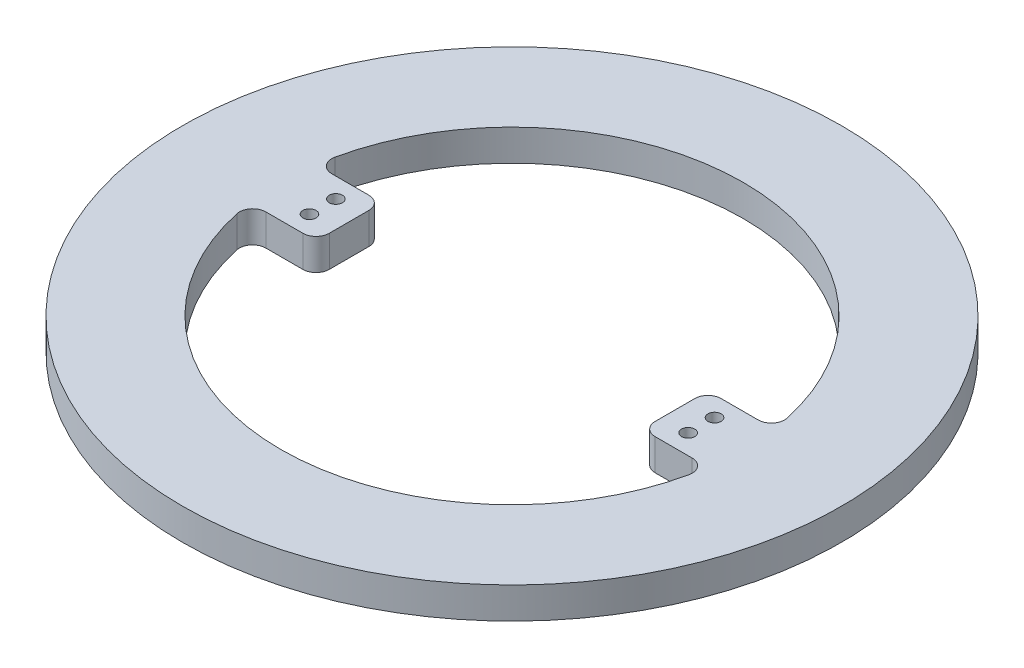
ISO-10303-21;
HEADER;
FILE_DESCRIPTION(('STEP AP214'),'2;1');
FILE_NAME('part.step','',(''),(''),'','','');
FILE_SCHEMA(('AUTOMOTIVE_DESIGN { 1 0 10303 214 1 1 1 1 }'));
ENDSEC;
DATA;
#1=APPLICATION_CONTEXT('core data for automotive mechanical design processes');
#2=APPLICATION_PROTOCOL_DEFINITION('international standard','automotive_design',2000,#1);
#3=PRODUCT_CONTEXT('',#1,'mechanical');
#4=PRODUCT('Part','Part','',(#3));
#5=PRODUCT_RELATED_PRODUCT_CATEGORY('part','',(#4));
#6=PRODUCT_DEFINITION_FORMATION('','',#4);
#7=PRODUCT_DEFINITION_CONTEXT('part definition',#1,'design');
#8=PRODUCT_DEFINITION('design','',#6,#7);
#9=PRODUCT_DEFINITION_SHAPE('','',#8);
#10=(LENGTH_UNIT() NAMED_UNIT(*) SI_UNIT(.MILLI.,.METRE.));
#11=(NAMED_UNIT(*) PLANE_ANGLE_UNIT() SI_UNIT($,.RADIAN.));
#12=(NAMED_UNIT(*) SI_UNIT($,.STERADIAN.) SOLID_ANGLE_UNIT());
#13=UNCERTAINTY_MEASURE_WITH_UNIT(LENGTH_MEASURE(1.E-05),#10,'distance_accuracy_value','');
#14=(GEOMETRIC_REPRESENTATION_CONTEXT(3) GLOBAL_UNCERTAINTY_ASSIGNED_CONTEXT((#13)) GLOBAL_UNIT_ASSIGNED_CONTEXT((#10,
#11,#12)) REPRESENTATION_CONTEXT('',''));
#15=CARTESIAN_POINT('',(0.,0.,0.));
#16=DIRECTION('',(0.,0.,1.));
#17=DIRECTION('',(1.,0.,0.));
#18=AXIS2_PLACEMENT_3D('',#15,#16,#17);
#19=CARTESIAN_POINT('',(0.,4.75,0.));
#20=DIRECTION('',(0.,1.,0.));
#21=DIRECTION('',(0.,0.,1.));
#22=AXIS2_PLACEMENT_3D('',#19,#20,#21);
#23=PLANE('',#22);
#24=CARTESIAN_POINT('',(28.6980858791868,4.75,2.));
#25=DIRECTION('',(0.,1.,0.));
#26=DIRECTION('',(0.,0.,-1.));
#27=AXIS2_PLACEMENT_3D('',#24,#25,#26);
#28=CIRCLE('',#27,1.);
#29=CARTESIAN_POINT('',(28.6980858791868,4.75,0.999999999999997));
#30=VERTEX_POINT('',#29);
#31=EDGE_CURVE('E527',#30,#30,#28,.T.);
#32=ORIENTED_EDGE('',*,*,#31,.F.);
#33=EDGE_LOOP('',(#32));
#34=FACE_BOUND('',#33,.T.);
#35=CARTESIAN_POINT('',(-28.6980858791868,4.75,2.));
#36=DIRECTION('',(0.,1.,0.));
#37=DIRECTION('',(0.,0.,1.));
#38=AXIS2_PLACEMENT_3D('',#35,#36,#37);
#39=CIRCLE('',#38,1.);
#40=CARTESIAN_POINT('',(-28.6980858791868,4.75,3.));
#41=VERTEX_POINT('',#40);
#42=EDGE_CURVE('E207',#41,#41,#39,.T.);
#43=ORIENTED_EDGE('',*,*,#42,.F.);
#44=EDGE_LOOP('',(#43));
#45=FACE_BOUND('',#44,.T.);
#46=CARTESIAN_POINT('',(0.,4.75,0.));
#47=DIRECTION('',(0.,1.,0.));
#48=DIRECTION('',(0.,0.,1.));
#49=AXIS2_PLACEMENT_3D('',#46,#47,#48);
#50=CIRCLE('',#49,49.95);
#51=CARTESIAN_POINT('',(0.,4.75,49.95));
#52=VERTEX_POINT('',#51);
#53=EDGE_CURVE('E11',#52,#52,#50,.T.);
#54=ORIENTED_EDGE('',*,*,#53,.T.);
#55=EDGE_LOOP('',(#54));
#56=FACE_BOUND('',#55,.T.);
#57=DIRECTION('',(-1.,0.,0.));
#58=VECTOR('',#57,1.);
#59=CARTESIAN_POINT('',(26.6980858791869,4.75,5.));
#60=LINE('',#59,#58);
#61=CARTESIAN_POINT('',(32.3068293455141,4.75,5.));
#62=VERTEX_POINT('',#61);
#63=CARTESIAN_POINT('',(26.6980858791869,4.75,5.));
#64=VERTEX_POINT('',#63);
#65=EDGE_CURVE('E162',#62,#64,#60,.T.);
#66=ORIENTED_EDGE('',*,*,#65,.F.);
#67=CARTESIAN_POINT('',(32.3068293455141,4.75,7.));
#68=DIRECTION('',(0.,1.,0.));
#69=DIRECTION('',(0.,0.,-1.));
#70=AXIS2_PLACEMENT_3D('',#67,#68,#69);
#71=CIRCLE('',#70,2.);
#72=CARTESIAN_POINT('',(34.2614732844072,4.75,7.42351749922346));
#73=VERTEX_POINT('',#72);
#74=EDGE_CURVE('E154',#73,#62,#71,.T.);
#75=ORIENTED_EDGE('',*,*,#74,.F.);
#76=CARTESIAN_POINT('',(0.,4.75,0.));
#77=DIRECTION('',(0.,1.,0.));
#78=DIRECTION('',(0.,0.,1.));
#79=AXIS2_PLACEMENT_3D('',#76,#77,#78);
#80=CIRCLE('',#79,35.0564853298135);
#81=CARTESIAN_POINT('',(-34.2614732844072,4.75,7.42351749922347));
#82=VERTEX_POINT('',#81);
#83=EDGE_CURVE('E204',#82,#73,#80,.T.);
#84=ORIENTED_EDGE('',*,*,#83,.F.);
#85=CARTESIAN_POINT('',(-32.3068293455141,4.75,7.));
#86=DIRECTION('',(0.,1.,0.));
#87=DIRECTION('',(0.,0.,1.));
#88=AXIS2_PLACEMENT_3D('',#85,#86,#87);
#89=CIRCLE('',#88,2.);
#90=CARTESIAN_POINT('',(-32.3068293455141,4.75,5.));
#91=VERTEX_POINT('',#90);
#92=EDGE_CURVE('E202',#91,#82,#89,.T.);
#93=ORIENTED_EDGE('',*,*,#92,.F.);
#94=DIRECTION('',(-1.,0.,0.));
#95=VECTOR('',#94,1.);
#96=CARTESIAN_POINT('',(-32.3068293455141,4.75,5.));
#97=LINE('',#96,#95);
#98=CARTESIAN_POINT('',(-26.6980858791869,4.75,5.));
#99=VERTEX_POINT('',#98);
#100=EDGE_CURVE('E200',#99,#91,#97,.T.);
#101=ORIENTED_EDGE('',*,*,#100,.F.);
#102=CARTESIAN_POINT('',(-26.6980858791868,4.75,3.));
#103=DIRECTION('',(0.,-1.,0.));
#104=DIRECTION('',(0.,0.,-1.));
#105=AXIS2_PLACEMENT_3D('',#102,#103,#104);
#106=CIRCLE('',#105,2.);
#107=CARTESIAN_POINT('',(-24.6980858791868,4.75,2.99999999999999));
#108=VERTEX_POINT('',#107);
#109=EDGE_CURVE('E198',#108,#99,#106,.T.);
#110=ORIENTED_EDGE('',*,*,#109,.F.);
#111=DIRECTION('',(0.,0.,1.));
#112=VECTOR('',#111,1.);
#113=CARTESIAN_POINT('',(-24.6980858791868,4.75,-2.99999999999999));
#114=LINE('',#113,#112);
#115=CARTESIAN_POINT('',(-24.6980858791868,4.75,-2.99999999999999));
#116=VERTEX_POINT('',#115);
#117=EDGE_CURVE('E196',#116,#108,#114,.T.);
#118=ORIENTED_EDGE('',*,*,#117,.F.);
#119=CARTESIAN_POINT('',(-26.6980858791868,4.75,-3.));
#120=DIRECTION('',(0.,-1.,0.));
#121=DIRECTION('',(0.,0.,1.));
#122=AXIS2_PLACEMENT_3D('',#119,#120,#121);
#123=CIRCLE('',#122,2.);
#124=CARTESIAN_POINT('',(-26.6980858791869,4.75,-5.));
#125=VERTEX_POINT('',#124);
#126=EDGE_CURVE('E194',#125,#116,#123,.T.);
#127=ORIENTED_EDGE('',*,*,#126,.F.);
#128=DIRECTION('',(1.,0.,0.));
#129=VECTOR('',#128,1.);
#130=CARTESIAN_POINT('',(-32.3068293455141,4.75,-5.));
#131=LINE('',#130,#129);
#132=CARTESIAN_POINT('',(-32.3068293455141,4.75,-5.));
#133=VERTEX_POINT('',#132);
#134=EDGE_CURVE('E192',#133,#125,#131,.T.);
#135=ORIENTED_EDGE('',*,*,#134,.F.);
#136=CARTESIAN_POINT('',(-32.3068293455141,4.75,-7.));
#137=DIRECTION('',(0.,1.,0.));
#138=DIRECTION('',(0.,0.,-1.));
#139=AXIS2_PLACEMENT_3D('',#136,#137,#138);
#140=CIRCLE('',#139,2.);
#141=CARTESIAN_POINT('',(-34.2614732844072,4.75,-7.42351749922347));
#142=VERTEX_POINT('',#141);
#143=EDGE_CURVE('E190',#142,#133,#140,.T.);
#144=ORIENTED_EDGE('',*,*,#143,.F.);
#145=CARTESIAN_POINT('',(0.,4.75,0.));
#146=DIRECTION('',(0.,1.,0.));
#147=DIRECTION('',(0.,0.,1.));
#148=AXIS2_PLACEMENT_3D('',#145,#146,#147);
#149=CIRCLE('',#148,35.0564853298135);
#150=CARTESIAN_POINT('',(34.2614732844072,4.75,-7.42351749922347));
#151=VERTEX_POINT('',#150);
#152=EDGE_CURVE('E188',#151,#142,#149,.T.);
#153=ORIENTED_EDGE('',*,*,#152,.F.);
#154=CARTESIAN_POINT('',(32.3068293455141,4.75,-7.));
#155=DIRECTION('',(0.,1.,0.));
#156=DIRECTION('',(0.,0.,1.));
#157=AXIS2_PLACEMENT_3D('',#154,#155,#156);
#158=CIRCLE('',#157,2.);
#159=CARTESIAN_POINT('',(32.3068293455141,4.75,-5.));
#160=VERTEX_POINT('',#159);
#161=EDGE_CURVE('E186',#160,#151,#158,.T.);
#162=ORIENTED_EDGE('',*,*,#161,.F.);
#163=DIRECTION('',(1.,0.,0.));
#164=VECTOR('',#163,1.);
#165=CARTESIAN_POINT('',(26.6980858791869,4.75,-5.));
#166=LINE('',#165,#164);
#167=CARTESIAN_POINT('',(26.6980858791868,4.75,-5.));
#168=VERTEX_POINT('',#167);
#169=EDGE_CURVE('E184',#168,#160,#166,.T.);
#170=ORIENTED_EDGE('',*,*,#169,.F.);
#171=CARTESIAN_POINT('',(26.6980858791868,4.75,-3.));
#172=DIRECTION('',(0.,-1.,0.));
#173=DIRECTION('',(0.,0.,-1.));
#174=AXIS2_PLACEMENT_3D('',#171,#172,#173);
#175=CIRCLE('',#174,2.);
#176=CARTESIAN_POINT('',(24.6980858791868,4.75,-2.99999999999999));
#177=VERTEX_POINT('',#176);
#178=EDGE_CURVE('E182',#177,#168,#175,.T.);
#179=ORIENTED_EDGE('',*,*,#178,.F.);
#180=DIRECTION('',(0.,0.,-1.));
#181=VECTOR('',#180,1.);
#182=CARTESIAN_POINT('',(24.6980858791868,4.75,-2.99999999999999));
#183=LINE('',#182,#181);
#184=CARTESIAN_POINT('',(24.6980858791868,4.75,2.99999999999999));
#185=VERTEX_POINT('',#184);
#186=EDGE_CURVE('E177',#185,#177,#183,.T.);
#187=ORIENTED_EDGE('',*,*,#186,.F.);
#188=CARTESIAN_POINT('',(26.6980858791868,4.75,3.));
#189=DIRECTION('',(0.,-1.,0.));
#190=DIRECTION('',(0.,0.,1.));
#191=AXIS2_PLACEMENT_3D('',#188,#189,#190);
#192=CIRCLE('',#191,2.);
#193=EDGE_CURVE('E175',#64,#185,#192,.T.);
#194=ORIENTED_EDGE('',*,*,#193,.F.);
#195=EDGE_LOOP('',(#66,#75,#84,#93,#101,#110,#118,#127,#135,#144,#153,#162,#170,#179,#187,#194));
#196=FACE_BOUND('',#195,.T.);
#197=CARTESIAN_POINT('',(-28.6980858791868,4.75,-2.));
#198=DIRECTION('',(0.,1.,0.));
#199=DIRECTION('',(0.,0.,-1.));
#200=AXIS2_PLACEMENT_3D('',#197,#198,#199);
#201=CIRCLE('',#200,1.);
#202=CARTESIAN_POINT('',(-28.6980858791868,4.75,-3.));
#203=VERTEX_POINT('',#202);
#204=EDGE_CURVE('E533',#203,#203,#201,.T.);
#205=ORIENTED_EDGE('',*,*,#204,.F.);
#206=EDGE_LOOP('',(#205));
#207=FACE_BOUND('',#206,.T.);
#208=CARTESIAN_POINT('',(28.6980858791868,4.75,-2.));
#209=DIRECTION('',(0.,1.,0.));
#210=DIRECTION('',(0.,0.,1.));
#211=AXIS2_PLACEMENT_3D('',#208,#209,#210);
#212=CIRCLE('',#211,1.);
#213=CARTESIAN_POINT('',(28.6980858791868,4.75,-0.999999999999997));
#214=VERTEX_POINT('',#213);
#215=EDGE_CURVE('E518',#214,#214,#212,.T.);
#216=ORIENTED_EDGE('',*,*,#215,.F.);
#217=EDGE_LOOP('',(#216));
#218=FACE_BOUND('',#217,.T.);
#219=ADVANCED_FACE('F41',(#34,#45,#56,#196,#207,#218),#23,.T.);
#220=CARTESIAN_POINT('',(0.,0.,0.));
#221=DIRECTION('',(0.,1.,0.));
#222=DIRECTION('',(0.,0.,1.));
#223=AXIS2_PLACEMENT_3D('',#220,#221,#222);
#224=PLANE('',#223);
#225=CARTESIAN_POINT('',(0.,0.,0.));
#226=DIRECTION('',(0.,1.,0.));
#227=DIRECTION('',(0.,0.,1.));
#228=AXIS2_PLACEMENT_3D('',#225,#226,#227);
#229=CIRCLE('',#228,49.95);
#230=CARTESIAN_POINT('',(0.,0.,49.95));
#231=VERTEX_POINT('',#230);
#232=EDGE_CURVE('E45',#231,#231,#229,.T.);
#233=ORIENTED_EDGE('',*,*,#232,.F.);
#234=EDGE_LOOP('',(#233));
#235=FACE_BOUND('',#234,.T.);
#236=CARTESIAN_POINT('',(32.3068293455141,0.,7.));
#237=DIRECTION('',(0.,1.,0.));
#238=DIRECTION('',(0.,0.,-1.));
#239=AXIS2_PLACEMENT_3D('',#236,#237,#238);
#240=CIRCLE('',#239,2.);
#241=CARTESIAN_POINT('',(34.2614732844072,0.,7.42351749922346));
#242=VERTEX_POINT('',#241);
#243=CARTESIAN_POINT('',(32.3068293455141,0.,5.));
#244=VERTEX_POINT('',#243);
#245=EDGE_CURVE('E64',#242,#244,#240,.T.);
#246=ORIENTED_EDGE('',*,*,#245,.T.);
#247=DIRECTION('',(-1.,0.,0.));
#248=VECTOR('',#247,1.);
#249=CARTESIAN_POINT('',(26.6980858791869,0.,5.));
#250=LINE('',#249,#248);
#251=CARTESIAN_POINT('',(26.6980858791869,0.,5.));
#252=VERTEX_POINT('',#251);
#253=EDGE_CURVE('E169',#244,#252,#250,.T.);
#254=ORIENTED_EDGE('',*,*,#253,.T.);
#255=CARTESIAN_POINT('',(26.6980858791868,0.,3.));
#256=DIRECTION('',(0.,-1.,0.));
#257=DIRECTION('',(0.,0.,1.));
#258=AXIS2_PLACEMENT_3D('',#255,#256,#257);
#259=CIRCLE('',#258,2.);
#260=CARTESIAN_POINT('',(24.6980858791868,0.,2.99999999999999));
#261=VERTEX_POINT('',#260);
#262=EDGE_CURVE('E209',#252,#261,#259,.T.);
#263=ORIENTED_EDGE('',*,*,#262,.T.);
#264=DIRECTION('',(0.,0.,-1.));
#265=VECTOR('',#264,1.);
#266=CARTESIAN_POINT('',(24.6980858791868,0.,-2.99999999999999));
#267=LINE('',#266,#265);
#268=CARTESIAN_POINT('',(24.6980858791868,0.,-2.99999999999999));
#269=VERTEX_POINT('',#268);
#270=EDGE_CURVE('E212',#261,#269,#267,.T.);
#271=ORIENTED_EDGE('',*,*,#270,.T.);
#272=CARTESIAN_POINT('',(26.6980858791868,0.,-3.));
#273=DIRECTION('',(0.,-1.,0.));
#274=DIRECTION('',(0.,0.,-1.));
#275=AXIS2_PLACEMENT_3D('',#272,#273,#274);
#276=CIRCLE('',#275,2.);
#277=CARTESIAN_POINT('',(26.6980858791868,0.,-5.));
#278=VERTEX_POINT('',#277);
#279=EDGE_CURVE('E215',#269,#278,#276,.T.);
#280=ORIENTED_EDGE('',*,*,#279,.T.);
#281=DIRECTION('',(1.,0.,0.));
#282=VECTOR('',#281,1.);
#283=CARTESIAN_POINT('',(26.6980858791869,0.,-5.));
#284=LINE('',#283,#282);
#285=CARTESIAN_POINT('',(32.3068293455141,0.,-5.));
#286=VERTEX_POINT('',#285);
#287=EDGE_CURVE('E218',#278,#286,#284,.T.);
#288=ORIENTED_EDGE('',*,*,#287,.T.);
#289=CARTESIAN_POINT('',(32.3068293455141,0.,-7.));
#290=DIRECTION('',(0.,1.,0.));
#291=DIRECTION('',(0.,0.,1.));
#292=AXIS2_PLACEMENT_3D('',#289,#290,#291);
#293=CIRCLE('',#292,2.);
#294=CARTESIAN_POINT('',(34.2614732844072,0.,-7.42351749922347));
#295=VERTEX_POINT('',#294);
#296=EDGE_CURVE('E221',#286,#295,#293,.T.);
#297=ORIENTED_EDGE('',*,*,#296,.T.);
#298=CARTESIAN_POINT('',(0.,0.,0.));
#299=DIRECTION('',(0.,1.,0.));
#300=DIRECTION('',(0.,0.,1.));
#301=AXIS2_PLACEMENT_3D('',#298,#299,#300);
#302=CIRCLE('',#301,35.0564853298135);
#303=CARTESIAN_POINT('',(-34.2614732844072,0.,-7.42351749922347));
#304=VERTEX_POINT('',#303);
#305=EDGE_CURVE('E224',#295,#304,#302,.T.);
#306=ORIENTED_EDGE('',*,*,#305,.T.);
#307=CARTESIAN_POINT('',(-32.3068293455141,0.,-7.));
#308=DIRECTION('',(0.,1.,0.));
#309=DIRECTION('',(0.,0.,-1.));
#310=AXIS2_PLACEMENT_3D('',#307,#308,#309);
#311=CIRCLE('',#310,2.);
#312=CARTESIAN_POINT('',(-32.3068293455141,0.,-5.));
#313=VERTEX_POINT('',#312);
#314=EDGE_CURVE('E227',#304,#313,#311,.T.);
#315=ORIENTED_EDGE('',*,*,#314,.T.);
#316=DIRECTION('',(1.,0.,0.));
#317=VECTOR('',#316,1.);
#318=CARTESIAN_POINT('',(-32.3068293455141,0.,-5.));
#319=LINE('',#318,#317);
#320=CARTESIAN_POINT('',(-26.6980858791869,0.,-5.));
#321=VERTEX_POINT('',#320);
#322=EDGE_CURVE('E230',#313,#321,#319,.T.);
#323=ORIENTED_EDGE('',*,*,#322,.T.);
#324=CARTESIAN_POINT('',(-26.6980858791868,0.,-3.));
#325=DIRECTION('',(0.,-1.,0.));
#326=DIRECTION('',(0.,0.,1.));
#327=AXIS2_PLACEMENT_3D('',#324,#325,#326);
#328=CIRCLE('',#327,2.);
#329=CARTESIAN_POINT('',(-24.6980858791868,0.,-2.99999999999999));
#330=VERTEX_POINT('',#329);
#331=EDGE_CURVE('E233',#321,#330,#328,.T.);
#332=ORIENTED_EDGE('',*,*,#331,.T.);
#333=DIRECTION('',(0.,0.,1.));
#334=VECTOR('',#333,1.);
#335=CARTESIAN_POINT('',(-24.6980858791868,0.,-2.99999999999999));
#336=LINE('',#335,#334);
#337=CARTESIAN_POINT('',(-24.6980858791868,0.,2.99999999999999));
#338=VERTEX_POINT('',#337);
#339=EDGE_CURVE('E236',#330,#338,#336,.T.);
#340=ORIENTED_EDGE('',*,*,#339,.T.);
#341=CARTESIAN_POINT('',(-26.6980858791868,0.,3.));
#342=DIRECTION('',(0.,-1.,0.));
#343=DIRECTION('',(0.,0.,-1.));
#344=AXIS2_PLACEMENT_3D('',#341,#342,#343);
#345=CIRCLE('',#344,2.);
#346=CARTESIAN_POINT('',(-26.6980858791869,0.,5.));
#347=VERTEX_POINT('',#346);
#348=EDGE_CURVE('E239',#338,#347,#345,.T.);
#349=ORIENTED_EDGE('',*,*,#348,.T.);
#350=DIRECTION('',(-1.,0.,0.));
#351=VECTOR('',#350,1.);
#352=CARTESIAN_POINT('',(-32.3068293455141,0.,5.));
#353=LINE('',#352,#351);
#354=CARTESIAN_POINT('',(-32.3068293455141,0.,5.));
#355=VERTEX_POINT('',#354);
#356=EDGE_CURVE('E242',#347,#355,#353,.T.);
#357=ORIENTED_EDGE('',*,*,#356,.T.);
#358=CARTESIAN_POINT('',(-32.3068293455141,0.,7.));
#359=DIRECTION('',(0.,1.,0.));
#360=DIRECTION('',(0.,0.,1.));
#361=AXIS2_PLACEMENT_3D('',#358,#359,#360);
#362=CIRCLE('',#361,2.);
#363=CARTESIAN_POINT('',(-34.2614732844072,0.,7.42351749922347));
#364=VERTEX_POINT('',#363);
#365=EDGE_CURVE('E245',#355,#364,#362,.T.);
#366=ORIENTED_EDGE('',*,*,#365,.T.);
#367=CARTESIAN_POINT('',(0.,0.,0.));
#368=DIRECTION('',(0.,1.,0.));
#369=DIRECTION('',(0.,0.,1.));
#370=AXIS2_PLACEMENT_3D('',#367,#368,#369);
#371=CIRCLE('',#370,35.0564853298135);
#372=EDGE_CURVE('E163',#364,#242,#371,.T.);
#373=ORIENTED_EDGE('',*,*,#372,.T.);
#374=EDGE_LOOP('',(#246,#254,#263,#271,#280,#288,#297,#306,#315,#323,#332,#340,#349,#357,#366,#373));
#375=FACE_BOUND('',#374,.T.);
#376=CARTESIAN_POINT('',(-28.6980858791868,0.,2.));
#377=DIRECTION('',(0.,1.,0.));
#378=DIRECTION('',(0.,0.,1.));
#379=AXIS2_PLACEMENT_3D('',#376,#377,#378);
#380=CIRCLE('',#379,1.);
#381=CARTESIAN_POINT('',(-28.6980858791868,0.,3.));
#382=VERTEX_POINT('',#381);
#383=EDGE_CURVE('E536',#382,#382,#380,.T.);
#384=ORIENTED_EDGE('',*,*,#383,.T.);
#385=EDGE_LOOP('',(#384));
#386=FACE_BOUND('',#385,.T.);
#387=CARTESIAN_POINT('',(-28.6980858791868,0.,-2.));
#388=DIRECTION('',(0.,1.,0.));
#389=DIRECTION('',(0.,0.,-1.));
#390=AXIS2_PLACEMENT_3D('',#387,#388,#389);
#391=CIRCLE('',#390,1.);
#392=CARTESIAN_POINT('',(-28.6980858791868,0.,-3.));
#393=VERTEX_POINT('',#392);
#394=EDGE_CURVE('E530',#393,#393,#391,.T.);
#395=ORIENTED_EDGE('',*,*,#394,.T.);
#396=EDGE_LOOP('',(#395));
#397=FACE_BOUND('',#396,.T.);
#398=CARTESIAN_POINT('',(28.6980858791868,0.,2.));
#399=DIRECTION('',(0.,1.,0.));
#400=DIRECTION('',(0.,0.,-1.));
#401=AXIS2_PLACEMENT_3D('',#398,#399,#400);
#402=CIRCLE('',#401,1.);
#403=CARTESIAN_POINT('',(28.6980858791868,0.,0.999999999999997));
#404=VERTEX_POINT('',#403);
#405=EDGE_CURVE('E524',#404,#404,#402,.T.);
#406=ORIENTED_EDGE('',*,*,#405,.T.);
#407=EDGE_LOOP('',(#406));
#408=FACE_BOUND('',#407,.T.);
#409=CARTESIAN_POINT('',(28.6980858791868,0.,-2.));
#410=DIRECTION('',(0.,1.,0.));
#411=DIRECTION('',(0.,0.,1.));
#412=AXIS2_PLACEMENT_3D('',#409,#410,#411);
#413=CIRCLE('',#412,1.);
#414=CARTESIAN_POINT('',(28.6980858791868,0.,-0.999999999999997));
#415=VERTEX_POINT('',#414);
#416=EDGE_CURVE('E521',#415,#415,#413,.T.);
#417=ORIENTED_EDGE('',*,*,#416,.T.);
#418=EDGE_LOOP('',(#417));
#419=FACE_BOUND('',#418,.T.);
#420=ADVANCED_FACE('F282',(#235,#375,#386,#397,#408,#419),#224,.F.);
#421=CARTESIAN_POINT('',(0.,4.75,0.));
#422=DIRECTION('',(0.,-1.,0.));
#423=DIRECTION('',(0.,0.,-1.));
#424=AXIS2_PLACEMENT_3D('',#421,#422,#423);
#425=CYLINDRICAL_SURFACE('',#424,49.95);
#426=ORIENTED_EDGE('',*,*,#53,.F.);
#427=EDGE_LOOP('',(#426));
#428=FACE_BOUND('',#427,.T.);
#429=ORIENTED_EDGE('',*,*,#232,.T.);
#430=EDGE_LOOP('',(#429));
#431=FACE_BOUND('',#430,.T.);
#432=ADVANCED_FACE('F43',(#428,#431),#425,.T.);
#433=CARTESIAN_POINT('',(32.3068293455141,4.75,7.));
#434=DIRECTION('',(0.,-1.,0.));
#435=DIRECTION('',(0.,0.,-1.));
#436=AXIS2_PLACEMENT_3D('',#433,#434,#435);
#437=CYLINDRICAL_SURFACE('',#436,2.);
#438=ORIENTED_EDGE('',*,*,#245,.F.);
#439=DIRECTION('',(0.,-1.,0.));
#440=VECTOR('',#439,1.);
#441=CARTESIAN_POINT('',(34.2614732844072,4.75,7.42351749922346));
#442=LINE('',#441,#440);
#443=EDGE_CURVE('E158',#73,#242,#442,.T.);
#444=ORIENTED_EDGE('',*,*,#443,.F.);
#445=ORIENTED_EDGE('',*,*,#74,.T.);
#446=DIRECTION('',(0.,-1.,0.));
#447=VECTOR('',#446,1.);
#448=CARTESIAN_POINT('',(32.3068293455141,4.75,5.));
#449=LINE('',#448,#447);
#450=EDGE_CURVE('E157',#62,#244,#449,.T.);
#451=ORIENTED_EDGE('',*,*,#450,.T.);
#452=EDGE_LOOP('',(#438,#444,#445,#451));
#453=FACE_BOUND('',#452,.T.);
#454=ADVANCED_FACE('F156',(#453),#437,.F.);
#455=CARTESIAN_POINT('',(26.6980858791869,4.75,5.));
#456=DIRECTION('',(0.,0.,1.));
#457=DIRECTION('',(1.,0.,0.));
#458=AXIS2_PLACEMENT_3D('',#455,#456,#457);
#459=PLANE('',#458);
#460=ORIENTED_EDGE('',*,*,#253,.F.);
#461=ORIENTED_EDGE('',*,*,#450,.F.);
#462=ORIENTED_EDGE('',*,*,#65,.T.);
#463=DIRECTION('',(0.,-1.,0.));
#464=VECTOR('',#463,1.);
#465=CARTESIAN_POINT('',(26.6980858791869,4.75,5.));
#466=LINE('',#465,#464);
#467=EDGE_CURVE('E170',#64,#252,#466,.T.);
#468=ORIENTED_EDGE('',*,*,#467,.T.);
#469=EDGE_LOOP('',(#460,#461,#462,#468));
#470=FACE_BOUND('',#469,.T.);
#471=ADVANCED_FACE('F166',(#470),#459,.T.);
#472=CARTESIAN_POINT('',(26.6980858791868,4.75,3.));
#473=DIRECTION('',(0.,-1.,0.));
#474=DIRECTION('',(0.,0.,-1.));
#475=AXIS2_PLACEMENT_3D('',#472,#473,#474);
#476=CYLINDRICAL_SURFACE('',#475,2.);
#477=ORIENTED_EDGE('',*,*,#262,.F.);
#478=ORIENTED_EDGE('',*,*,#467,.F.);
#479=ORIENTED_EDGE('',*,*,#193,.T.);
#480=DIRECTION('',(0.,-1.,0.));
#481=VECTOR('',#480,1.);
#482=CARTESIAN_POINT('',(24.6980858791868,4.75,2.99999999999999));
#483=LINE('',#482,#481);
#484=EDGE_CURVE('E274',#185,#261,#483,.T.);
#485=ORIENTED_EDGE('',*,*,#484,.T.);
#486=EDGE_LOOP('',(#477,#478,#479,#485));
#487=FACE_BOUND('',#486,.T.);
#488=ADVANCED_FACE('F278',(#487),#476,.T.);
#489=CARTESIAN_POINT('',(24.6980858791868,4.75,-2.99999999999999));
#490=DIRECTION('',(-1.,0.,0.));
#491=DIRECTION('',(0.,0.,1.));
#492=AXIS2_PLACEMENT_3D('',#489,#490,#491);
#493=PLANE('',#492);
#494=ORIENTED_EDGE('',*,*,#270,.F.);
#495=ORIENTED_EDGE('',*,*,#484,.F.);
#496=ORIENTED_EDGE('',*,*,#186,.T.);
#497=DIRECTION('',(0.,-1.,0.));
#498=VECTOR('',#497,1.);
#499=CARTESIAN_POINT('',(24.6980858791868,4.75,-2.99999999999999));
#500=LINE('',#499,#498);
#501=EDGE_CURVE('E272',#177,#269,#500,.T.);
#502=ORIENTED_EDGE('',*,*,#501,.T.);
#503=EDGE_LOOP('',(#494,#495,#496,#502));
#504=FACE_BOUND('',#503,.T.);
#505=ADVANCED_FACE('F341',(#504),#493,.T.);
#506=CARTESIAN_POINT('',(26.6980858791868,4.75,-3.));
#507=DIRECTION('',(0.,-1.,0.));
#508=DIRECTION('',(0.,0.,-1.));
#509=AXIS2_PLACEMENT_3D('',#506,#507,#508);
#510=CYLINDRICAL_SURFACE('',#509,2.);
#511=ORIENTED_EDGE('',*,*,#279,.F.);
#512=ORIENTED_EDGE('',*,*,#501,.F.);
#513=ORIENTED_EDGE('',*,*,#178,.T.);
#514=DIRECTION('',(0.,-1.,0.));
#515=VECTOR('',#514,1.);
#516=CARTESIAN_POINT('',(26.6980858791868,4.75,-5.));
#517=LINE('',#516,#515);
#518=EDGE_CURVE('E270',#168,#278,#517,.T.);
#519=ORIENTED_EDGE('',*,*,#518,.T.);
#520=EDGE_LOOP('',(#511,#512,#513,#519));
#521=FACE_BOUND('',#520,.T.);
#522=ADVANCED_FACE('F338',(#521),#510,.T.);
#523=CARTESIAN_POINT('',(26.6980858791869,4.75,-5.));
#524=DIRECTION('',(0.,0.,-1.));
#525=DIRECTION('',(-1.,0.,0.));
#526=AXIS2_PLACEMENT_3D('',#523,#524,#525);
#527=PLANE('',#526);
#528=ORIENTED_EDGE('',*,*,#287,.F.);
#529=ORIENTED_EDGE('',*,*,#518,.F.);
#530=ORIENTED_EDGE('',*,*,#169,.T.);
#531=DIRECTION('',(0.,-1.,0.));
#532=VECTOR('',#531,1.);
#533=CARTESIAN_POINT('',(32.3068293455141,4.75,-5.));
#534=LINE('',#533,#532);
#535=EDGE_CURVE('E268',#160,#286,#534,.T.);
#536=ORIENTED_EDGE('',*,*,#535,.T.);
#537=EDGE_LOOP('',(#528,#529,#530,#536));
#538=FACE_BOUND('',#537,.T.);
#539=ADVANCED_FACE('F335',(#538),#527,.T.);
#540=CARTESIAN_POINT('',(32.3068293455141,4.75,-7.));
#541=DIRECTION('',(0.,-1.,0.));
#542=DIRECTION('',(0.,0.,-1.));
#543=AXIS2_PLACEMENT_3D('',#540,#541,#542);
#544=CYLINDRICAL_SURFACE('',#543,2.);
#545=ORIENTED_EDGE('',*,*,#296,.F.);
#546=ORIENTED_EDGE('',*,*,#535,.F.);
#547=ORIENTED_EDGE('',*,*,#161,.T.);
#548=DIRECTION('',(0.,-1.,0.));
#549=VECTOR('',#548,1.);
#550=CARTESIAN_POINT('',(34.2614732844072,4.75,-7.42351749922347));
#551=LINE('',#550,#549);
#552=EDGE_CURVE('E266',#151,#295,#551,.T.);
#553=ORIENTED_EDGE('',*,*,#552,.T.);
#554=EDGE_LOOP('',(#545,#546,#547,#553));
#555=FACE_BOUND('',#554,.T.);
#556=ADVANCED_FACE('F328',(#555),#544,.F.);
#557=CARTESIAN_POINT('',(0.,4.75,0.));
#558=DIRECTION('',(0.,-1.,0.));
#559=DIRECTION('',(0.,0.,-1.));
#560=AXIS2_PLACEMENT_3D('',#557,#558,#559);
#561=CYLINDRICAL_SURFACE('',#560,35.0564853298135);
#562=ORIENTED_EDGE('',*,*,#305,.F.);
#563=ORIENTED_EDGE('',*,*,#552,.F.);
#564=ORIENTED_EDGE('',*,*,#152,.T.);
#565=DIRECTION('',(0.,-1.,0.));
#566=VECTOR('',#565,1.);
#567=CARTESIAN_POINT('',(-34.2614732844072,4.75,-7.42351749922347));
#568=LINE('',#567,#566);
#569=EDGE_CURVE('E264',#142,#304,#568,.T.);
#570=ORIENTED_EDGE('',*,*,#569,.T.);
#571=EDGE_LOOP('',(#562,#563,#564,#570));
#572=FACE_BOUND('',#571,.T.);
#573=ADVANCED_FACE('F324',(#572),#561,.F.);
#574=CARTESIAN_POINT('',(-32.3068293455141,4.75,-7.));
#575=DIRECTION('',(0.,-1.,0.));
#576=DIRECTION('',(0.,0.,-1.));
#577=AXIS2_PLACEMENT_3D('',#574,#575,#576);
#578=CYLINDRICAL_SURFACE('',#577,2.);
#579=ORIENTED_EDGE('',*,*,#314,.F.);
#580=ORIENTED_EDGE('',*,*,#569,.F.);
#581=ORIENTED_EDGE('',*,*,#143,.T.);
#582=DIRECTION('',(0.,-1.,0.));
#583=VECTOR('',#582,1.);
#584=CARTESIAN_POINT('',(-32.3068293455141,4.75,-5.));
#585=LINE('',#584,#583);
#586=EDGE_CURVE('E262',#133,#313,#585,.T.);
#587=ORIENTED_EDGE('',*,*,#586,.T.);
#588=EDGE_LOOP('',(#579,#580,#581,#587));
#589=FACE_BOUND('',#588,.T.);
#590=ADVANCED_FACE('F321',(#589),#578,.F.);
#591=CARTESIAN_POINT('',(-32.3068293455141,4.75,-5.));
#592=DIRECTION('',(0.,0.,-1.));
#593=DIRECTION('',(-1.,0.,0.));
#594=AXIS2_PLACEMENT_3D('',#591,#592,#593);
#595=PLANE('',#594);
#596=ORIENTED_EDGE('',*,*,#322,.F.);
#597=ORIENTED_EDGE('',*,*,#586,.F.);
#598=ORIENTED_EDGE('',*,*,#134,.T.);
#599=DIRECTION('',(0.,-1.,0.));
#600=VECTOR('',#599,1.);
#601=CARTESIAN_POINT('',(-26.6980858791869,4.75,-5.));
#602=LINE('',#601,#600);
#603=EDGE_CURVE('E260',#125,#321,#602,.T.);
#604=ORIENTED_EDGE('',*,*,#603,.T.);
#605=EDGE_LOOP('',(#596,#597,#598,#604));
#606=FACE_BOUND('',#605,.T.);
#607=ADVANCED_FACE('F313',(#606),#595,.T.);
#608=CARTESIAN_POINT('',(-26.6980858791868,4.75,-3.));
#609=DIRECTION('',(0.,-1.,0.));
#610=DIRECTION('',(0.,0.,-1.));
#611=AXIS2_PLACEMENT_3D('',#608,#609,#610);
#612=CYLINDRICAL_SURFACE('',#611,2.);
#613=ORIENTED_EDGE('',*,*,#331,.F.);
#614=ORIENTED_EDGE('',*,*,#603,.F.);
#615=ORIENTED_EDGE('',*,*,#126,.T.);
#616=DIRECTION('',(0.,-1.,0.));
#617=VECTOR('',#616,1.);
#618=CARTESIAN_POINT('',(-24.6980858791868,4.75,-2.99999999999999));
#619=LINE('',#618,#617);
#620=EDGE_CURVE('E258',#116,#330,#619,.T.);
#621=ORIENTED_EDGE('',*,*,#620,.T.);
#622=EDGE_LOOP('',(#613,#614,#615,#621));
#623=FACE_BOUND('',#622,.T.);
#624=ADVANCED_FACE('F309',(#623),#612,.T.);
#625=CARTESIAN_POINT('',(-24.6980858791868,4.75,-2.99999999999999));
#626=DIRECTION('',(1.,0.,0.));
#627=DIRECTION('',(0.,0.,-1.));
#628=AXIS2_PLACEMENT_3D('',#625,#626,#627);
#629=PLANE('',#628);
#630=ORIENTED_EDGE('',*,*,#339,.F.);
#631=ORIENTED_EDGE('',*,*,#620,.F.);
#632=ORIENTED_EDGE('',*,*,#117,.T.);
#633=DIRECTION('',(0.,-1.,0.));
#634=VECTOR('',#633,1.);
#635=CARTESIAN_POINT('',(-24.6980858791868,4.75,2.99999999999999));
#636=LINE('',#635,#634);
#637=EDGE_CURVE('E256',#108,#338,#636,.T.);
#638=ORIENTED_EDGE('',*,*,#637,.T.);
#639=EDGE_LOOP('',(#630,#631,#632,#638));
#640=FACE_BOUND('',#639,.T.);
#641=ADVANCED_FACE('F306',(#640),#629,.T.);
#642=CARTESIAN_POINT('',(-26.6980858791868,4.75,3.));
#643=DIRECTION('',(0.,-1.,0.));
#644=DIRECTION('',(0.,0.,-1.));
#645=AXIS2_PLACEMENT_3D('',#642,#643,#644);
#646=CYLINDRICAL_SURFACE('',#645,2.);
#647=ORIENTED_EDGE('',*,*,#348,.F.);
#648=ORIENTED_EDGE('',*,*,#637,.F.);
#649=ORIENTED_EDGE('',*,*,#109,.T.);
#650=DIRECTION('',(0.,-1.,0.));
#651=VECTOR('',#650,1.);
#652=CARTESIAN_POINT('',(-26.6980858791869,4.75,5.));
#653=LINE('',#652,#651);
#654=EDGE_CURVE('E254',#99,#347,#653,.T.);
#655=ORIENTED_EDGE('',*,*,#654,.T.);
#656=EDGE_LOOP('',(#647,#648,#649,#655));
#657=FACE_BOUND('',#656,.T.);
#658=ADVANCED_FACE('F298',(#657),#646,.T.);
#659=CARTESIAN_POINT('',(-32.3068293455141,4.75,5.));
#660=DIRECTION('',(0.,0.,1.));
#661=DIRECTION('',(1.,0.,0.));
#662=AXIS2_PLACEMENT_3D('',#659,#660,#661);
#663=PLANE('',#662);
#664=ORIENTED_EDGE('',*,*,#356,.F.);
#665=ORIENTED_EDGE('',*,*,#654,.F.);
#666=ORIENTED_EDGE('',*,*,#100,.T.);
#667=DIRECTION('',(0.,-1.,0.));
#668=VECTOR('',#667,1.);
#669=CARTESIAN_POINT('',(-32.3068293455141,4.75,5.));
#670=LINE('',#669,#668);
#671=EDGE_CURVE('E252',#91,#355,#670,.T.);
#672=ORIENTED_EDGE('',*,*,#671,.T.);
#673=EDGE_LOOP('',(#664,#665,#666,#672));
#674=FACE_BOUND('',#673,.T.);
#675=ADVANCED_FACE('F294',(#674),#663,.T.);
#676=CARTESIAN_POINT('',(-32.3068293455141,4.75,7.));
#677=DIRECTION('',(0.,-1.,0.));
#678=DIRECTION('',(0.,0.,-1.));
#679=AXIS2_PLACEMENT_3D('',#676,#677,#678);
#680=CYLINDRICAL_SURFACE('',#679,2.);
#681=ORIENTED_EDGE('',*,*,#365,.F.);
#682=ORIENTED_EDGE('',*,*,#671,.F.);
#683=ORIENTED_EDGE('',*,*,#92,.T.);
#684=DIRECTION('',(0.,-1.,0.));
#685=VECTOR('',#684,1.);
#686=CARTESIAN_POINT('',(-34.2614732844072,4.75,7.42351749922347));
#687=LINE('',#686,#685);
#688=EDGE_CURVE('E56',#82,#364,#687,.T.);
#689=ORIENTED_EDGE('',*,*,#688,.T.);
#690=EDGE_LOOP('',(#681,#682,#683,#689));
#691=FACE_BOUND('',#690,.T.);
#692=ADVANCED_FACE('F291',(#691),#680,.F.);
#693=CARTESIAN_POINT('',(0.,4.75,0.));
#694=DIRECTION('',(0.,-1.,0.));
#695=DIRECTION('',(0.,0.,-1.));
#696=AXIS2_PLACEMENT_3D('',#693,#694,#695);
#697=CYLINDRICAL_SURFACE('',#696,35.0564853298135);
#698=ORIENTED_EDGE('',*,*,#372,.F.);
#699=ORIENTED_EDGE('',*,*,#688,.F.);
#700=ORIENTED_EDGE('',*,*,#83,.T.);
#701=ORIENTED_EDGE('',*,*,#443,.T.);
#702=EDGE_LOOP('',(#698,#699,#700,#701));
#703=FACE_BOUND('',#702,.T.);
#704=ADVANCED_FACE('F285',(#703),#697,.F.);
#705=CARTESIAN_POINT('',(-28.6980858791868,4.75,2.));
#706=DIRECTION('',(0.,-1.,0.));
#707=DIRECTION('',(0.,0.,-1.));
#708=AXIS2_PLACEMENT_3D('',#705,#706,#707);
#709=CYLINDRICAL_SURFACE('',#708,1.);
#710=ORIENTED_EDGE('',*,*,#42,.T.);
#711=EDGE_LOOP('',(#710));
#712=FACE_BOUND('',#711,.T.);
#713=ORIENTED_EDGE('',*,*,#383,.F.);
#714=EDGE_LOOP('',(#713));
#715=FACE_BOUND('',#714,.T.);
#716=ADVANCED_FACE('F473',(#712,#715),#709,.F.);
#717=CARTESIAN_POINT('',(-28.6980858791868,4.75,-2.));
#718=DIRECTION('',(0.,-1.,0.));
#719=DIRECTION('',(0.,0.,-1.));
#720=AXIS2_PLACEMENT_3D('',#717,#718,#719);
#721=CYLINDRICAL_SURFACE('',#720,1.);
#722=ORIENTED_EDGE('',*,*,#204,.T.);
#723=EDGE_LOOP('',(#722));
#724=FACE_BOUND('',#723,.T.);
#725=ORIENTED_EDGE('',*,*,#394,.F.);
#726=EDGE_LOOP('',(#725));
#727=FACE_BOUND('',#726,.T.);
#728=ADVANCED_FACE('F482',(#724,#727),#721,.F.);
#729=CARTESIAN_POINT('',(28.6980858791868,4.75,2.));
#730=DIRECTION('',(0.,-1.,0.));
#731=DIRECTION('',(0.,0.,-1.));
#732=AXIS2_PLACEMENT_3D('',#729,#730,#731);
#733=CYLINDRICAL_SURFACE('',#732,1.);
#734=ORIENTED_EDGE('',*,*,#31,.T.);
#735=EDGE_LOOP('',(#734));
#736=FACE_BOUND('',#735,.T.);
#737=ORIENTED_EDGE('',*,*,#405,.F.);
#738=EDGE_LOOP('',(#737));
#739=FACE_BOUND('',#738,.T.);
#740=ADVANCED_FACE('F492',(#736,#739),#733,.F.);
#741=CARTESIAN_POINT('',(28.6980858791868,4.75,-2.));
#742=DIRECTION('',(0.,-1.,0.));
#743=DIRECTION('',(0.,0.,-1.));
#744=AXIS2_PLACEMENT_3D('',#741,#742,#743);
#745=CYLINDRICAL_SURFACE('',#744,1.);
#746=ORIENTED_EDGE('',*,*,#215,.T.);
#747=EDGE_LOOP('',(#746));
#748=FACE_BOUND('',#747,.T.);
#749=ORIENTED_EDGE('',*,*,#416,.F.);
#750=EDGE_LOOP('',(#749));
#751=FACE_BOUND('',#750,.T.);
#752=ADVANCED_FACE('F502',(#748,#751),#745,.F.);
#753=CLOSED_SHELL('',(#219,#420,#432,#454,#471,#488,#505,#522,#539,#556,#573,#590,#607,#624,
#641,#658,#675,#692,#704,#716,#728,#740,#752));
#754=MANIFOLD_SOLID_BREP('B2',#753);
#755=ADVANCED_BREP_SHAPE_REPRESENTATION('',(#18,#754),#14);
#756=SHAPE_DEFINITION_REPRESENTATION(#9,#755);
ENDSEC;
END-ISO-10303-21;
